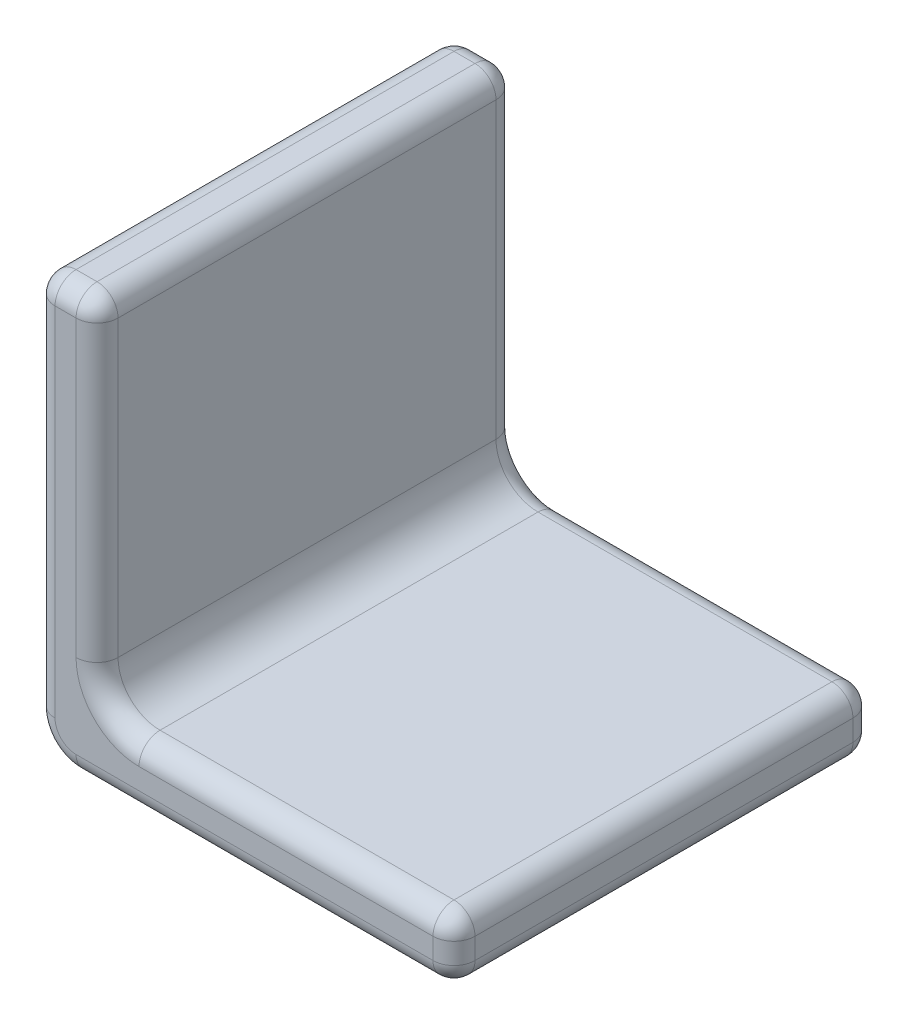
ISO-10303-21;
HEADER;
FILE_DESCRIPTION(('STEP AP214'),'2;1');
FILE_NAME('part.step','',(''),(''),'','','');
FILE_SCHEMA(('AUTOMOTIVE_DESIGN { 1 0 10303 214 1 1 1 1 }'));
ENDSEC;
DATA;
#1=APPLICATION_CONTEXT('core data for automotive mechanical design processes');
#2=APPLICATION_PROTOCOL_DEFINITION('international standard','automotive_design',2000,#1);
#3=PRODUCT_CONTEXT('',#1,'mechanical');
#4=PRODUCT('Part','Part','',(#3));
#5=PRODUCT_RELATED_PRODUCT_CATEGORY('part','',(#4));
#6=PRODUCT_DEFINITION_FORMATION('','',#4);
#7=PRODUCT_DEFINITION_CONTEXT('part definition',#1,'design');
#8=PRODUCT_DEFINITION('design','',#6,#7);
#9=PRODUCT_DEFINITION_SHAPE('','',#8);
#10=(LENGTH_UNIT() NAMED_UNIT(*) SI_UNIT(.MILLI.,.METRE.));
#11=(NAMED_UNIT(*) PLANE_ANGLE_UNIT() SI_UNIT($,.RADIAN.));
#12=(NAMED_UNIT(*) SI_UNIT($,.STERADIAN.) SOLID_ANGLE_UNIT());
#13=UNCERTAINTY_MEASURE_WITH_UNIT(LENGTH_MEASURE(1.E-05),#10,'distance_accuracy_value','');
#14=(GEOMETRIC_REPRESENTATION_CONTEXT(3) GLOBAL_UNCERTAINTY_ASSIGNED_CONTEXT((#13)) GLOBAL_UNIT_ASSIGNED_CONTEXT((#10,
#11,#12)) REPRESENTATION_CONTEXT('',''));
#15=CARTESIAN_POINT('',(0.,0.,0.));
#16=DIRECTION('',(0.,0.,1.));
#17=DIRECTION('',(1.,0.,0.));
#18=AXIS2_PLACEMENT_3D('',#15,#16,#17);
#19=CARTESIAN_POINT('',(5.,5.,20.));
#20=DIRECTION('',(0.,0.,-1.));
#21=DIRECTION('',(-1.,0.,0.));
#22=AXIS2_PLACEMENT_3D('',#19,#20,#21);
#23=CYLINDRICAL_SURFACE('',#22,2.);
#24=DIRECTION('',(0.,0.,-1.));
#25=VECTOR('',#24,1.);
#26=CARTESIAN_POINT('',(5.00000000000002,3.,20.));
#27=LINE('',#26,#25);
#28=CARTESIAN_POINT('',(5.00000000000002,3.,19.));
#29=VERTEX_POINT('',#28);
#30=CARTESIAN_POINT('',(5.00000000000002,3.,1.));
#31=VERTEX_POINT('',#30);
#32=EDGE_CURVE('E323',#29,#31,#27,.T.);
#33=ORIENTED_EDGE('',*,*,#32,.T.);
#34=CARTESIAN_POINT('',(5.,5.,1.));
#35=DIRECTION('',(0.,0.,1.));
#36=DIRECTION('',(1.,0.,0.));
#37=AXIS2_PLACEMENT_3D('',#34,#35,#36);
#38=CIRCLE('',#37,2.);
#39=CARTESIAN_POINT('',(3.,5.00000000000002,1.));
#40=VERTEX_POINT('',#39);
#41=EDGE_CURVE('E275',#31,#40,#38,.F.);
#42=ORIENTED_EDGE('',*,*,#41,.T.);
#43=DIRECTION('',(0.,0.,-1.));
#44=VECTOR('',#43,1.);
#45=CARTESIAN_POINT('',(3.,5.00000000000002,20.));
#46=LINE('',#45,#44);
#47=CARTESIAN_POINT('',(3.,5.00000000000002,19.));
#48=VERTEX_POINT('',#47);
#49=EDGE_CURVE('E199',#48,#40,#46,.T.);
#50=ORIENTED_EDGE('',*,*,#49,.F.);
#51=CARTESIAN_POINT('',(5.,5.,19.));
#52=DIRECTION('',(0.,0.,1.));
#53=DIRECTION('',(1.,0.,0.));
#54=AXIS2_PLACEMENT_3D('',#51,#52,#53);
#55=CIRCLE('',#54,2.);
#56=EDGE_CURVE('E273',#48,#29,#55,.T.);
#57=ORIENTED_EDGE('',*,*,#56,.T.);
#58=EDGE_LOOP('',(#33,#42,#50,#57));
#59=FACE_BOUND('',#58,.T.);
#60=ADVANCED_FACE('F39',(#59),#23,.F.);
#61=CARTESIAN_POINT('',(3.,5.00000000000002,20.));
#62=DIRECTION('',(-1.,0.,0.));
#63=DIRECTION('',(0.,0.,1.));
#64=AXIS2_PLACEMENT_3D('',#61,#62,#63);
#65=PLANE('',#64);
#66=ORIENTED_EDGE('',*,*,#49,.T.);
#67=DIRECTION('',(0.,1.,0.));
#68=VECTOR('',#67,1.);
#69=CARTESIAN_POINT('',(3.,5.00000000000002,1.));
#70=LINE('',#69,#68);
#71=CARTESIAN_POINT('',(3.,19.,1.));
#72=VERTEX_POINT('',#71);
#73=EDGE_CURVE('E198',#40,#72,#70,.T.);
#74=ORIENTED_EDGE('',*,*,#73,.T.);
#75=DIRECTION('',(0.,0.,-1.));
#76=VECTOR('',#75,1.);
#77=CARTESIAN_POINT('',(3.,19.,20.));
#78=LINE('',#77,#76);
#79=CARTESIAN_POINT('',(3.,19.,19.));
#80=VERTEX_POINT('',#79);
#81=EDGE_CURVE('E180',#80,#72,#78,.T.);
#82=ORIENTED_EDGE('',*,*,#81,.F.);
#83=DIRECTION('',(0.,1.,0.));
#84=VECTOR('',#83,1.);
#85=CARTESIAN_POINT('',(3.,5.00000000000002,19.));
#86=LINE('',#85,#84);
#87=EDGE_CURVE('E195',#80,#48,#86,.F.);
#88=ORIENTED_EDGE('',*,*,#87,.T.);
#89=EDGE_LOOP('',(#66,#74,#82,#88));
#90=FACE_BOUND('',#89,.T.);
#91=ADVANCED_FACE('F193',(#90),#65,.F.);
#92=CARTESIAN_POINT('',(2.,19.,20.));
#93=DIRECTION('',(0.,0.,-1.));
#94=DIRECTION('',(-1.,0.,0.));
#95=AXIS2_PLACEMENT_3D('',#92,#93,#94);
#96=CYLINDRICAL_SURFACE('',#95,1.);
#97=ORIENTED_EDGE('',*,*,#81,.T.);
#98=CARTESIAN_POINT('',(2.,19.,1.));
#99=DIRECTION('',(0.,0.,-1.));
#100=DIRECTION('',(-1.,0.,0.));
#101=AXIS2_PLACEMENT_3D('',#98,#99,#100);
#102=CIRCLE('',#101,1.);
#103=CARTESIAN_POINT('',(1.99999999999999,20.,1.));
#104=VERTEX_POINT('',#103);
#105=EDGE_CURVE('E187',#72,#104,#102,.F.);
#106=ORIENTED_EDGE('',*,*,#105,.T.);
#107=DIRECTION('',(0.,0.,-1.));
#108=VECTOR('',#107,1.);
#109=CARTESIAN_POINT('',(1.99999999999999,20.,20.));
#110=LINE('',#109,#108);
#111=CARTESIAN_POINT('',(1.99999999999999,20.,19.));
#112=VERTEX_POINT('',#111);
#113=EDGE_CURVE('E182',#112,#104,#110,.T.);
#114=ORIENTED_EDGE('',*,*,#113,.F.);
#115=CARTESIAN_POINT('',(2.,19.,19.));
#116=DIRECTION('',(0.,0.,-1.));
#117=DIRECTION('',(-1.,0.,0.));
#118=AXIS2_PLACEMENT_3D('',#115,#116,#117);
#119=CIRCLE('',#118,1.);
#120=EDGE_CURVE('E177',#112,#80,#119,.T.);
#121=ORIENTED_EDGE('',*,*,#120,.T.);
#122=EDGE_LOOP('',(#97,#106,#114,#121));
#123=FACE_BOUND('',#122,.T.);
#124=ADVANCED_FACE('F179',(#123),#96,.T.);
#125=CARTESIAN_POINT('',(1.00000000000001,20.,20.));
#126=DIRECTION('',(0.,-1.,0.));
#127=DIRECTION('',(0.,0.,-1.));
#128=AXIS2_PLACEMENT_3D('',#125,#126,#127);
#129=PLANE('',#128);
#130=ORIENTED_EDGE('',*,*,#113,.T.);
#131=DIRECTION('',(-1.,0.,0.));
#132=VECTOR('',#131,1.);
#133=CARTESIAN_POINT('',(1.00000000000001,20.,1.));
#134=LINE('',#133,#132);
#135=CARTESIAN_POINT('',(1.00000000000001,20.,1.));
#136=VERTEX_POINT('',#135);
#137=EDGE_CURVE('E238',#104,#136,#134,.T.);
#138=ORIENTED_EDGE('',*,*,#137,.T.);
#139=DIRECTION('',(0.,0.,-1.));
#140=VECTOR('',#139,1.);
#141=CARTESIAN_POINT('',(1.00000000000001,20.,20.));
#142=LINE('',#141,#140);
#143=CARTESIAN_POINT('',(1.00000000000001,20.,19.));
#144=VERTEX_POINT('',#143);
#145=EDGE_CURVE('E372',#144,#136,#142,.T.);
#146=ORIENTED_EDGE('',*,*,#145,.F.);
#147=DIRECTION('',(-1.,0.,0.));
#148=VECTOR('',#147,1.);
#149=CARTESIAN_POINT('',(1.99999999999999,20.,19.));
#150=LINE('',#149,#148);
#151=EDGE_CURVE('E236',#144,#112,#150,.F.);
#152=ORIENTED_EDGE('',*,*,#151,.T.);
#153=EDGE_LOOP('',(#130,#138,#146,#152));
#154=FACE_BOUND('',#153,.T.);
#155=ADVANCED_FACE('F381',(#154),#129,.F.);
#156=CARTESIAN_POINT('',(1.,19.,20.));
#157=DIRECTION('',(0.,0.,-1.));
#158=DIRECTION('',(-1.,0.,0.));
#159=AXIS2_PLACEMENT_3D('',#156,#157,#158);
#160=CYLINDRICAL_SURFACE('',#159,1.);
#161=ORIENTED_EDGE('',*,*,#145,.T.);
#162=CARTESIAN_POINT('',(1.,19.,1.));
#163=DIRECTION('',(0.,0.,-1.));
#164=DIRECTION('',(-1.,0.,0.));
#165=AXIS2_PLACEMENT_3D('',#162,#163,#164);
#166=CIRCLE('',#165,1.);
#167=CARTESIAN_POINT('',(0.,19.,1.));
#168=VERTEX_POINT('',#167);
#169=EDGE_CURVE('E242',#136,#168,#166,.F.);
#170=ORIENTED_EDGE('',*,*,#169,.T.);
#171=DIRECTION('',(0.,0.,-1.));
#172=VECTOR('',#171,1.);
#173=CARTESIAN_POINT('',(0.,19.,20.));
#174=LINE('',#173,#172);
#175=CARTESIAN_POINT('',(0.,19.,19.));
#176=VERTEX_POINT('',#175);
#177=EDGE_CURVE('E363',#176,#168,#174,.T.);
#178=ORIENTED_EDGE('',*,*,#177,.F.);
#179=CARTESIAN_POINT('',(1.,19.,19.));
#180=DIRECTION('',(0.,0.,-1.));
#181=DIRECTION('',(-1.,0.,0.));
#182=AXIS2_PLACEMENT_3D('',#179,#180,#181);
#183=CIRCLE('',#182,1.);
#184=EDGE_CURVE('E240',#176,#144,#183,.T.);
#185=ORIENTED_EDGE('',*,*,#184,.T.);
#186=EDGE_LOOP('',(#161,#170,#178,#185));
#187=FACE_BOUND('',#186,.T.);
#188=ADVANCED_FACE('F369',(#187),#160,.T.);
#189=CARTESIAN_POINT('',(0.,2.00000000000001,20.));
#190=DIRECTION('',(1.,0.,0.));
#191=DIRECTION('',(0.,0.,-1.));
#192=AXIS2_PLACEMENT_3D('',#189,#190,#191);
#193=PLANE('',#192);
#194=ORIENTED_EDGE('',*,*,#177,.T.);
#195=DIRECTION('',(0.,-1.,0.));
#196=VECTOR('',#195,1.);
#197=CARTESIAN_POINT('',(0.,2.00000000000001,1.));
#198=LINE('',#197,#196);
#199=CARTESIAN_POINT('',(0.,2.00000000000001,1.));
#200=VERTEX_POINT('',#199);
#201=EDGE_CURVE('E246',#168,#200,#198,.T.);
#202=ORIENTED_EDGE('',*,*,#201,.T.);
#203=DIRECTION('',(0.,0.,-1.));
#204=VECTOR('',#203,1.);
#205=CARTESIAN_POINT('',(0.,2.00000000000001,20.));
#206=LINE('',#205,#204);
#207=CARTESIAN_POINT('',(0.,2.00000000000001,19.));
#208=VERTEX_POINT('',#207);
#209=EDGE_CURVE('E366',#208,#200,#206,.T.);
#210=ORIENTED_EDGE('',*,*,#209,.F.);
#211=DIRECTION('',(0.,-1.,0.));
#212=VECTOR('',#211,1.);
#213=CARTESIAN_POINT('',(0.,19.,19.));
#214=LINE('',#213,#212);
#215=EDGE_CURVE('E244',#208,#176,#214,.F.);
#216=ORIENTED_EDGE('',*,*,#215,.T.);
#217=EDGE_LOOP('',(#194,#202,#210,#216));
#218=FACE_BOUND('',#217,.T.);
#219=ADVANCED_FACE('F362',(#218),#193,.F.);
#220=CARTESIAN_POINT('',(2.,2.,20.));
#221=DIRECTION('',(0.,0.,-1.));
#222=DIRECTION('',(-1.,0.,0.));
#223=AXIS2_PLACEMENT_3D('',#220,#221,#222);
#224=CYLINDRICAL_SURFACE('',#223,2.);
#225=ORIENTED_EDGE('',*,*,#209,.T.);
#226=CARTESIAN_POINT('',(2.,2.,1.));
#227=DIRECTION('',(0.,0.,1.));
#228=DIRECTION('',(1.,0.,0.));
#229=AXIS2_PLACEMENT_3D('',#226,#227,#228);
#230=CIRCLE('',#229,2.);
#231=CARTESIAN_POINT('',(2.00000000000001,0.,1.));
#232=VERTEX_POINT('',#231);
#233=EDGE_CURVE('E250',#200,#232,#230,.T.);
#234=ORIENTED_EDGE('',*,*,#233,.T.);
#235=DIRECTION('',(0.,0.,-1.));
#236=VECTOR('',#235,1.);
#237=CARTESIAN_POINT('',(2.00000000000001,0.,20.));
#238=LINE('',#237,#236);
#239=CARTESIAN_POINT('',(2.00000000000001,0.,19.));
#240=VERTEX_POINT('',#239);
#241=EDGE_CURVE('E375',#240,#232,#238,.T.);
#242=ORIENTED_EDGE('',*,*,#241,.F.);
#243=CARTESIAN_POINT('',(2.,2.,19.));
#244=DIRECTION('',(0.,0.,1.));
#245=DIRECTION('',(1.,0.,0.));
#246=AXIS2_PLACEMENT_3D('',#243,#244,#245);
#247=CIRCLE('',#246,2.);
#248=EDGE_CURVE('E248',#240,#208,#247,.F.);
#249=ORIENTED_EDGE('',*,*,#248,.T.);
#250=EDGE_LOOP('',(#225,#234,#242,#249));
#251=FACE_BOUND('',#250,.T.);
#252=ADVANCED_FACE('F749',(#251),#224,.T.);
#253=CARTESIAN_POINT('',(5.67919075144509,0.,20.));
#254=DIRECTION('',(0.,1.,0.));
#255=DIRECTION('',(0.,0.,1.));
#256=AXIS2_PLACEMENT_3D('',#253,#254,#255);
#257=PLANE('',#256);
#258=ORIENTED_EDGE('',*,*,#241,.T.);
#259=DIRECTION('',(1.,0.,0.));
#260=VECTOR('',#259,1.);
#261=CARTESIAN_POINT('',(5.67919075144509,0.,1.));
#262=LINE('',#261,#260);
#263=CARTESIAN_POINT('',(19.,0.,1.));
#264=VERTEX_POINT('',#263);
#265=EDGE_CURVE('E254',#232,#264,#262,.T.);
#266=ORIENTED_EDGE('',*,*,#265,.T.);
#267=DIRECTION('',(0.,0.,-1.));
#268=VECTOR('',#267,1.);
#269=CARTESIAN_POINT('',(19.,0.,20.));
#270=LINE('',#269,#268);
#271=CARTESIAN_POINT('',(19.,0.,19.));
#272=VERTEX_POINT('',#271);
#273=EDGE_CURVE('E831',#272,#264,#270,.T.);
#274=ORIENTED_EDGE('',*,*,#273,.F.);
#275=DIRECTION('',(1.,0.,0.));
#276=VECTOR('',#275,1.);
#277=CARTESIAN_POINT('',(2.00000000000001,0.,19.));
#278=LINE('',#277,#276);
#279=EDGE_CURVE('E252',#272,#240,#278,.F.);
#280=ORIENTED_EDGE('',*,*,#279,.T.);
#281=EDGE_LOOP('',(#258,#266,#274,#280));
#282=FACE_BOUND('',#281,.T.);
#283=ADVANCED_FACE('F738',(#282),#257,.F.);
#284=CARTESIAN_POINT('',(19.,1.,20.));
#285=DIRECTION('',(0.,0.,-1.));
#286=DIRECTION('',(-1.,0.,0.));
#287=AXIS2_PLACEMENT_3D('',#284,#285,#286);
#288=CYLINDRICAL_SURFACE('',#287,1.);
#289=ORIENTED_EDGE('',*,*,#273,.T.);
#290=CARTESIAN_POINT('',(19.,1.,1.));
#291=DIRECTION('',(0.,0.,-1.));
#292=DIRECTION('',(-1.,0.,0.));
#293=AXIS2_PLACEMENT_3D('',#290,#291,#292);
#294=CIRCLE('',#293,1.);
#295=CARTESIAN_POINT('',(20.,1.,1.));
#296=VERTEX_POINT('',#295);
#297=EDGE_CURVE('E258',#264,#296,#294,.F.);
#298=ORIENTED_EDGE('',*,*,#297,.T.);
#299=DIRECTION('',(0.,0.,-1.));
#300=VECTOR('',#299,1.);
#301=CARTESIAN_POINT('',(20.,1.,20.));
#302=LINE('',#301,#300);
#303=CARTESIAN_POINT('',(20.,1.,19.));
#304=VERTEX_POINT('',#303);
#305=EDGE_CURVE('E836',#304,#296,#302,.T.);
#306=ORIENTED_EDGE('',*,*,#305,.F.);
#307=CARTESIAN_POINT('',(19.,1.,19.));
#308=DIRECTION('',(0.,0.,-1.));
#309=DIRECTION('',(-1.,0.,0.));
#310=AXIS2_PLACEMENT_3D('',#307,#308,#309);
#311=CIRCLE('',#310,1.);
#312=EDGE_CURVE('E256',#304,#272,#311,.T.);
#313=ORIENTED_EDGE('',*,*,#312,.T.);
#314=EDGE_LOOP('',(#289,#298,#306,#313));
#315=FACE_BOUND('',#314,.T.);
#316=ADVANCED_FACE('F727',(#315),#288,.T.);
#317=CARTESIAN_POINT('',(20.,1.,20.));
#318=DIRECTION('',(-1.,0.,0.));
#319=DIRECTION('',(0.,0.,1.));
#320=AXIS2_PLACEMENT_3D('',#317,#318,#319);
#321=PLANE('',#320);
#322=ORIENTED_EDGE('',*,*,#305,.T.);
#323=DIRECTION('',(0.,1.,0.));
#324=VECTOR('',#323,1.);
#325=CARTESIAN_POINT('',(20.,1.,1.));
#326=LINE('',#325,#324);
#327=CARTESIAN_POINT('',(20.,2.,1.));
#328=VERTEX_POINT('',#327);
#329=EDGE_CURVE('E262',#296,#328,#326,.T.);
#330=ORIENTED_EDGE('',*,*,#329,.T.);
#331=DIRECTION('',(0.,0.,-1.));
#332=VECTOR('',#331,1.);
#333=CARTESIAN_POINT('',(20.,2.,20.));
#334=LINE('',#333,#332);
#335=CARTESIAN_POINT('',(20.,2.,19.));
#336=VERTEX_POINT('',#335);
#337=EDGE_CURVE('E838',#336,#328,#334,.T.);
#338=ORIENTED_EDGE('',*,*,#337,.F.);
#339=DIRECTION('',(0.,1.,0.));
#340=VECTOR('',#339,1.);
#341=CARTESIAN_POINT('',(20.,1.,19.));
#342=LINE('',#341,#340);
#343=EDGE_CURVE('E260',#336,#304,#342,.F.);
#344=ORIENTED_EDGE('',*,*,#343,.T.);
#345=EDGE_LOOP('',(#322,#330,#338,#344));
#346=FACE_BOUND('',#345,.T.);
#347=ADVANCED_FACE('F716',(#346),#321,.F.);
#348=CARTESIAN_POINT('',(19.,2.,20.));
#349=DIRECTION('',(0.,0.,-1.));
#350=DIRECTION('',(-1.,0.,0.));
#351=AXIS2_PLACEMENT_3D('',#348,#349,#350);
#352=CYLINDRICAL_SURFACE('',#351,1.);
#353=ORIENTED_EDGE('',*,*,#337,.T.);
#354=CARTESIAN_POINT('',(19.,2.,1.));
#355=DIRECTION('',(0.,0.,-1.));
#356=DIRECTION('',(-1.,0.,0.));
#357=AXIS2_PLACEMENT_3D('',#354,#355,#356);
#358=CIRCLE('',#357,1.);
#359=CARTESIAN_POINT('',(19.,3.,1.));
#360=VERTEX_POINT('',#359);
#361=EDGE_CURVE('E266',#328,#360,#358,.F.);
#362=ORIENTED_EDGE('',*,*,#361,.T.);
#363=DIRECTION('',(0.,0.,-1.));
#364=VECTOR('',#363,1.);
#365=CARTESIAN_POINT('',(19.,3.,20.));
#366=LINE('',#365,#364);
#367=CARTESIAN_POINT('',(19.,3.,19.));
#368=VERTEX_POINT('',#367);
#369=EDGE_CURVE('E843',#368,#360,#366,.T.);
#370=ORIENTED_EDGE('',*,*,#369,.F.);
#371=CARTESIAN_POINT('',(19.,2.,19.));
#372=DIRECTION('',(0.,0.,-1.));
#373=DIRECTION('',(-1.,0.,0.));
#374=AXIS2_PLACEMENT_3D('',#371,#372,#373);
#375=CIRCLE('',#374,1.);
#376=EDGE_CURVE('E264',#368,#336,#375,.T.);
#377=ORIENTED_EDGE('',*,*,#376,.T.);
#378=EDGE_LOOP('',(#353,#362,#370,#377));
#379=FACE_BOUND('',#378,.T.);
#380=ADVANCED_FACE('F705',(#379),#352,.T.);
#381=CARTESIAN_POINT('',(5.00000000000002,3.,20.));
#382=DIRECTION('',(0.,-1.,0.));
#383=DIRECTION('',(0.,0.,-1.));
#384=AXIS2_PLACEMENT_3D('',#381,#382,#383);
#385=PLANE('',#384);
#386=ORIENTED_EDGE('',*,*,#369,.T.);
#387=DIRECTION('',(-1.,0.,0.));
#388=VECTOR('',#387,1.);
#389=CARTESIAN_POINT('',(5.00000000000002,3.,1.));
#390=LINE('',#389,#388);
#391=EDGE_CURVE('E271',#360,#31,#390,.T.);
#392=ORIENTED_EDGE('',*,*,#391,.T.);
#393=ORIENTED_EDGE('',*,*,#32,.F.);
#394=DIRECTION('',(-1.,0.,0.));
#395=VECTOR('',#394,1.);
#396=CARTESIAN_POINT('',(19.,3.,19.));
#397=LINE('',#396,#395);
#398=EDGE_CURVE('E268',#29,#368,#397,.F.);
#399=ORIENTED_EDGE('',*,*,#398,.T.);
#400=EDGE_LOOP('',(#386,#392,#393,#399));
#401=FACE_BOUND('',#400,.T.);
#402=ADVANCED_FACE('F695',(#401),#385,.F.);
#403=CARTESIAN_POINT('',(5.,5.,20.));
#404=DIRECTION('',(0.,0.,1.));
#405=DIRECTION('',(1.,0.,0.));
#406=AXIS2_PLACEMENT_3D('',#403,#404,#405);
#407=PLANE('',#406);
#408=DIRECTION('',(0.,1.,0.));
#409=VECTOR('',#408,1.);
#410=CARTESIAN_POINT('',(19.,2.,20.));
#411=LINE('',#410,#409);
#412=CARTESIAN_POINT('',(19.,1.,20.));
#413=VERTEX_POINT('',#412);
#414=CARTESIAN_POINT('',(19.,2.,20.));
#415=VERTEX_POINT('',#414);
#416=EDGE_CURVE('E48',#413,#415,#411,.T.);
#417=ORIENTED_EDGE('',*,*,#416,.T.);
#418=DIRECTION('',(-1.,0.,0.));
#419=VECTOR('',#418,1.);
#420=CARTESIAN_POINT('',(5.00000000000002,2.,20.));
#421=LINE('',#420,#419);
#422=CARTESIAN_POINT('',(5.00000000000002,2.,20.));
#423=VERTEX_POINT('',#422);
#424=EDGE_CURVE('E11',#415,#423,#421,.T.);
#425=ORIENTED_EDGE('',*,*,#424,.T.);
#426=CARTESIAN_POINT('',(5.,5.,20.));
#427=DIRECTION('',(0.,0.,1.));
#428=DIRECTION('',(1.,0.,0.));
#429=AXIS2_PLACEMENT_3D('',#426,#427,#428);
#430=CIRCLE('',#429,3.);
#431=CARTESIAN_POINT('',(2.,5.00000000000002,20.));
#432=VERTEX_POINT('',#431);
#433=EDGE_CURVE('E277',#423,#432,#430,.F.);
#434=ORIENTED_EDGE('',*,*,#433,.T.);
#435=DIRECTION('',(0.,1.,0.));
#436=VECTOR('',#435,1.);
#437=CARTESIAN_POINT('',(2.,19.,20.));
#438=LINE('',#437,#436);
#439=CARTESIAN_POINT('',(2.,19.,20.));
#440=VERTEX_POINT('',#439);
#441=EDGE_CURVE('E279',#432,#440,#438,.T.);
#442=ORIENTED_EDGE('',*,*,#441,.T.);
#443=DIRECTION('',(-1.,0.,0.));
#444=VECTOR('',#443,1.);
#445=CARTESIAN_POINT('',(1.00000000000001,19.,20.));
#446=LINE('',#445,#444);
#447=CARTESIAN_POINT('',(1.,19.,20.));
#448=VERTEX_POINT('',#447);
#449=EDGE_CURVE('E281',#440,#448,#446,.T.);
#450=ORIENTED_EDGE('',*,*,#449,.T.);
#451=DIRECTION('',(0.,-1.,0.));
#452=VECTOR('',#451,1.);
#453=CARTESIAN_POINT('',(1.,2.00000000000001,20.));
#454=LINE('',#453,#452);
#455=CARTESIAN_POINT('',(1.,2.00000000000001,20.));
#456=VERTEX_POINT('',#455);
#457=EDGE_CURVE('E283',#448,#456,#454,.T.);
#458=ORIENTED_EDGE('',*,*,#457,.T.);
#459=CARTESIAN_POINT('',(2.,2.,20.));
#460=DIRECTION('',(0.,0.,1.));
#461=DIRECTION('',(1.,0.,0.));
#462=AXIS2_PLACEMENT_3D('',#459,#460,#461);
#463=CIRCLE('',#462,1.);
#464=CARTESIAN_POINT('',(2.00000000000001,1.,20.));
#465=VERTEX_POINT('',#464);
#466=EDGE_CURVE('E285',#456,#465,#463,.T.);
#467=ORIENTED_EDGE('',*,*,#466,.T.);
#468=DIRECTION('',(1.,0.,0.));
#469=VECTOR('',#468,1.);
#470=CARTESIAN_POINT('',(19.,1.,20.));
#471=LINE('',#470,#469);
#472=EDGE_CURVE('E59',#465,#413,#471,.T.);
#473=ORIENTED_EDGE('',*,*,#472,.T.);
#474=EDGE_LOOP('',(#417,#425,#434,#442,#450,#458,#467,#473));
#475=FACE_BOUND('',#474,.T.);
#476=ADVANCED_FACE('F685',(#475),#407,.T.);
#477=CARTESIAN_POINT('',(5.,5.,0.));
#478=DIRECTION('',(0.,0.,1.));
#479=DIRECTION('',(1.,0.,0.));
#480=AXIS2_PLACEMENT_3D('',#477,#478,#479);
#481=PLANE('',#480);
#482=DIRECTION('',(-1.,0.,0.));
#483=VECTOR('',#482,1.);
#484=CARTESIAN_POINT('',(5.,19.,0.));
#485=LINE('',#484,#483);
#486=CARTESIAN_POINT('',(1.,19.,0.));
#487=VERTEX_POINT('',#486);
#488=CARTESIAN_POINT('',(2.,19.,0.));
#489=VERTEX_POINT('',#488);
#490=EDGE_CURVE('E231',#487,#489,#485,.F.);
#491=ORIENTED_EDGE('',*,*,#490,.T.);
#492=DIRECTION('',(0.,1.,0.));
#493=VECTOR('',#492,1.);
#494=CARTESIAN_POINT('',(2.,5.,0.));
#495=LINE('',#494,#493);
#496=CARTESIAN_POINT('',(2.,5.00000000000002,0.));
#497=VERTEX_POINT('',#496);
#498=EDGE_CURVE('E188',#489,#497,#495,.F.);
#499=ORIENTED_EDGE('',*,*,#498,.T.);
#500=CARTESIAN_POINT('',(5.,5.,0.));
#501=DIRECTION('',(0.,0.,1.));
#502=DIRECTION('',(1.,0.,0.));
#503=AXIS2_PLACEMENT_3D('',#500,#501,#502);
#504=CIRCLE('',#503,3.);
#505=CARTESIAN_POINT('',(5.00000000000002,2.,0.));
#506=VERTEX_POINT('',#505);
#507=EDGE_CURVE('E216',#497,#506,#504,.T.);
#508=ORIENTED_EDGE('',*,*,#507,.T.);
#509=DIRECTION('',(-1.,0.,0.));
#510=VECTOR('',#509,1.);
#511=CARTESIAN_POINT('',(5.,2.,0.));
#512=LINE('',#511,#510);
#513=CARTESIAN_POINT('',(19.,2.,0.));
#514=VERTEX_POINT('',#513);
#515=EDGE_CURVE('E221',#506,#514,#512,.F.);
#516=ORIENTED_EDGE('',*,*,#515,.T.);
#517=DIRECTION('',(0.,1.,0.));
#518=VECTOR('',#517,1.);
#519=CARTESIAN_POINT('',(19.,5.,0.));
#520=LINE('',#519,#518);
#521=CARTESIAN_POINT('',(19.,1.,0.));
#522=VERTEX_POINT('',#521);
#523=EDGE_CURVE('E223',#514,#522,#520,.F.);
#524=ORIENTED_EDGE('',*,*,#523,.T.);
#525=DIRECTION('',(1.,0.,0.));
#526=VECTOR('',#525,1.);
#527=CARTESIAN_POINT('',(5.,1.,0.));
#528=LINE('',#527,#526);
#529=CARTESIAN_POINT('',(2.00000000000001,1.,0.));
#530=VERTEX_POINT('',#529);
#531=EDGE_CURVE('E225',#522,#530,#528,.F.);
#532=ORIENTED_EDGE('',*,*,#531,.T.);
#533=CARTESIAN_POINT('',(2.,2.,0.));
#534=DIRECTION('',(0.,0.,1.));
#535=DIRECTION('',(1.,0.,0.));
#536=AXIS2_PLACEMENT_3D('',#533,#534,#535);
#537=CIRCLE('',#536,1.);
#538=CARTESIAN_POINT('',(1.,2.00000000000001,0.));
#539=VERTEX_POINT('',#538);
#540=EDGE_CURVE('E227',#530,#539,#537,.F.);
#541=ORIENTED_EDGE('',*,*,#540,.T.);
#542=DIRECTION('',(0.,-1.,0.));
#543=VECTOR('',#542,1.);
#544=CARTESIAN_POINT('',(1.,5.,0.));
#545=LINE('',#544,#543);
#546=EDGE_CURVE('E229',#539,#487,#545,.F.);
#547=ORIENTED_EDGE('',*,*,#546,.T.);
#548=EDGE_LOOP('',(#491,#499,#508,#516,#524,#532,#541,#547));
#549=FACE_BOUND('',#548,.T.);
#550=ADVANCED_FACE('F398',(#549),#481,.F.);
#551=CARTESIAN_POINT('',(5.67919075144509,1.,1.));
#552=DIRECTION('',(1.,0.,0.));
#553=DIRECTION('',(0.,0.,-1.));
#554=AXIS2_PLACEMENT_3D('',#551,#552,#553);
#555=CYLINDRICAL_SURFACE('',#554,1.);
#556=CARTESIAN_POINT('',(19.,1.,1.));
#557=DIRECTION('',(1.,0.,0.));
#558=DIRECTION('',(0.,0.,-1.));
#559=AXIS2_PLACEMENT_3D('',#556,#557,#558);
#560=CIRCLE('',#559,1.);
#561=EDGE_CURVE('E320',#264,#522,#560,.T.);
#562=ORIENTED_EDGE('',*,*,#561,.F.);
#563=ORIENTED_EDGE('',*,*,#265,.F.);
#564=CARTESIAN_POINT('',(2.00000000000001,1.,1.));
#565=DIRECTION('',(-1.,0.,0.));
#566=DIRECTION('',(0.,-1.,0.));
#567=AXIS2_PLACEMENT_3D('',#564,#565,#566);
#568=CIRCLE('',#567,1.);
#569=EDGE_CURVE('E317',#530,#232,#568,.T.);
#570=ORIENTED_EDGE('',*,*,#569,.F.);
#571=ORIENTED_EDGE('',*,*,#531,.F.);
#572=EDGE_LOOP('',(#562,#563,#570,#571));
#573=FACE_BOUND('',#572,.T.);
#574=ADVANCED_FACE('F664',(#573),#555,.T.);
#575=CARTESIAN_POINT('',(19.,1.,1.));
#576=DIRECTION('',(0.,0.,1.));
#577=DIRECTION('',(1.,0.,0.));
#578=AXIS2_PLACEMENT_3D('',#575,#576,#577);
#579=SPHERICAL_SURFACE('',#578,1.);
#580=ORIENTED_EDGE('',*,*,#297,.F.);
#581=ORIENTED_EDGE('',*,*,#561,.T.);
#582=CARTESIAN_POINT('',(19.,1.,1.));
#583=DIRECTION('',(0.,1.,0.));
#584=DIRECTION('',(0.,0.,1.));
#585=AXIS2_PLACEMENT_3D('',#582,#583,#584);
#586=CIRCLE('',#585,1.);
#587=EDGE_CURVE('E314',#296,#522,#586,.T.);
#588=ORIENTED_EDGE('',*,*,#587,.F.);
#589=EDGE_LOOP('',(#580,#581,#588));
#590=FACE_BOUND('',#589,.T.);
#591=ADVANCED_FACE('F653',(#590),#579,.T.);
#592=CARTESIAN_POINT('',(2.,2.,1.));
#593=DIRECTION('',(0.,0.,1.));
#594=DIRECTION('',(1.,0.,0.));
#595=AXIS2_PLACEMENT_3D('',#592,#593,#594);
#596=DEGENERATE_TOROIDAL_SURFACE('',#595,1.,1.,.T.);
#597=ORIENTED_EDGE('',*,*,#569,.T.);
#598=ORIENTED_EDGE('',*,*,#233,.F.);
#599=CARTESIAN_POINT('',(1.,2.00000000000001,1.));
#600=DIRECTION('',(0.,1.,0.));
#601=DIRECTION('',(0.,0.,1.));
#602=AXIS2_PLACEMENT_3D('',#599,#600,#601);
#603=CIRCLE('',#602,1.);
#604=EDGE_CURVE('E311',#539,#200,#603,.T.);
#605=ORIENTED_EDGE('',*,*,#604,.F.);
#606=ORIENTED_EDGE('',*,*,#540,.F.);
#607=EDGE_LOOP('',(#597,#598,#605,#606));
#608=FACE_BOUND('',#607,.T.);
#609=ADVANCED_FACE('F642',(#608),#596,.T.);
#610=CARTESIAN_POINT('',(19.,1.,1.));
#611=DIRECTION('',(0.,1.,0.));
#612=DIRECTION('',(0.,0.,1.));
#613=AXIS2_PLACEMENT_3D('',#610,#611,#612);
#614=CYLINDRICAL_SURFACE('',#613,1.);
#615=ORIENTED_EDGE('',*,*,#587,.T.);
#616=ORIENTED_EDGE('',*,*,#523,.F.);
#617=CARTESIAN_POINT('',(19.,2.,1.));
#618=DIRECTION('',(0.,1.,0.));
#619=DIRECTION('',(0.,0.,1.));
#620=AXIS2_PLACEMENT_3D('',#617,#618,#619);
#621=CIRCLE('',#620,1.);
#622=EDGE_CURVE('E308',#328,#514,#621,.T.);
#623=ORIENTED_EDGE('',*,*,#622,.F.);
#624=ORIENTED_EDGE('',*,*,#329,.F.);
#625=EDGE_LOOP('',(#615,#616,#623,#624));
#626=FACE_BOUND('',#625,.T.);
#627=ADVANCED_FACE('F632',(#626),#614,.T.);
#628=CARTESIAN_POINT('',(1.,2.00000000000001,1.));
#629=DIRECTION('',(0.,-1.,0.));
#630=DIRECTION('',(0.,0.,-1.));
#631=AXIS2_PLACEMENT_3D('',#628,#629,#630);
#632=CYLINDRICAL_SURFACE('',#631,1.);
#633=ORIENTED_EDGE('',*,*,#604,.T.);
#634=ORIENTED_EDGE('',*,*,#201,.F.);
#635=CARTESIAN_POINT('',(1.,19.,1.));
#636=DIRECTION('',(0.,1.,0.));
#637=DIRECTION('',(-1.,0.,0.));
#638=AXIS2_PLACEMENT_3D('',#635,#636,#637);
#639=CIRCLE('',#638,1.);
#640=EDGE_CURVE('E305',#487,#168,#639,.T.);
#641=ORIENTED_EDGE('',*,*,#640,.F.);
#642=ORIENTED_EDGE('',*,*,#546,.F.);
#643=EDGE_LOOP('',(#633,#634,#641,#642));
#644=FACE_BOUND('',#643,.T.);
#645=ADVANCED_FACE('F405',(#644),#632,.T.);
#646=CARTESIAN_POINT('',(19.,2.,1.));
#647=DIRECTION('',(0.,0.,1.));
#648=DIRECTION('',(1.,0.,0.));
#649=AXIS2_PLACEMENT_3D('',#646,#647,#648);
#650=SPHERICAL_SURFACE('',#649,1.);
#651=ORIENTED_EDGE('',*,*,#361,.F.);
#652=ORIENTED_EDGE('',*,*,#622,.T.);
#653=CARTESIAN_POINT('',(19.,2.,1.));
#654=DIRECTION('',(-1.,0.,0.));
#655=DIRECTION('',(0.,0.,1.));
#656=AXIS2_PLACEMENT_3D('',#653,#654,#655);
#657=CIRCLE('',#656,1.);
#658=EDGE_CURVE('E302',#360,#514,#657,.T.);
#659=ORIENTED_EDGE('',*,*,#658,.F.);
#660=EDGE_LOOP('',(#651,#652,#659));
#661=FACE_BOUND('',#660,.T.);
#662=ADVANCED_FACE('F410',(#661),#650,.T.);
#663=CARTESIAN_POINT('',(1.,19.,1.));
#664=DIRECTION('',(0.,0.,1.));
#665=DIRECTION('',(1.,0.,0.));
#666=AXIS2_PLACEMENT_3D('',#663,#664,#665);
#667=SPHERICAL_SURFACE('',#666,1.);
#668=ORIENTED_EDGE('',*,*,#640,.T.);
#669=ORIENTED_EDGE('',*,*,#169,.F.);
#670=CARTESIAN_POINT('',(1.,19.,1.));
#671=DIRECTION('',(1.,0.,0.));
#672=DIRECTION('',(0.,1.,0.));
#673=AXIS2_PLACEMENT_3D('',#670,#671,#672);
#674=CIRCLE('',#673,1.);
#675=EDGE_CURVE('E299',#487,#136,#674,.T.);
#676=ORIENTED_EDGE('',*,*,#675,.F.);
#677=EDGE_LOOP('',(#668,#669,#676));
#678=FACE_BOUND('',#677,.T.);
#679=ADVANCED_FACE('F407',(#678),#667,.T.);
#680=CARTESIAN_POINT('',(5.00000000000002,2.,1.));
#681=DIRECTION('',(-1.,0.,0.));
#682=DIRECTION('',(0.,0.,1.));
#683=AXIS2_PLACEMENT_3D('',#680,#681,#682);
#684=CYLINDRICAL_SURFACE('',#683,1.);
#685=ORIENTED_EDGE('',*,*,#658,.T.);
#686=ORIENTED_EDGE('',*,*,#515,.F.);
#687=CARTESIAN_POINT('',(5.00000000000002,2.,1.));
#688=DIRECTION('',(-1.,0.,0.));
#689=DIRECTION('',(0.,0.,1.));
#690=AXIS2_PLACEMENT_3D('',#687,#688,#689);
#691=CIRCLE('',#690,1.);
#692=EDGE_CURVE('E296',#31,#506,#691,.T.);
#693=ORIENTED_EDGE('',*,*,#692,.F.);
#694=ORIENTED_EDGE('',*,*,#391,.F.);
#695=EDGE_LOOP('',(#685,#686,#693,#694));
#696=FACE_BOUND('',#695,.T.);
#697=ADVANCED_FACE('F409',(#696),#684,.T.);
#698=CARTESIAN_POINT('',(1.00000000000001,19.,1.));
#699=DIRECTION('',(-1.,0.,0.));
#700=DIRECTION('',(0.,0.,1.));
#701=AXIS2_PLACEMENT_3D('',#698,#699,#700);
#702=CYLINDRICAL_SURFACE('',#701,1.);
#703=ORIENTED_EDGE('',*,*,#675,.T.);
#704=ORIENTED_EDGE('',*,*,#137,.F.);
#705=CARTESIAN_POINT('',(2.,19.,1.));
#706=DIRECTION('',(1.,0.,0.));
#707=DIRECTION('',(0.,1.,0.));
#708=AXIS2_PLACEMENT_3D('',#705,#706,#707);
#709=CIRCLE('',#708,1.);
#710=EDGE_CURVE('E293',#489,#104,#709,.T.);
#711=ORIENTED_EDGE('',*,*,#710,.F.);
#712=ORIENTED_EDGE('',*,*,#490,.F.);
#713=EDGE_LOOP('',(#703,#704,#711,#712));
#714=FACE_BOUND('',#713,.T.);
#715=ADVANCED_FACE('F385',(#714),#702,.T.);
#716=CARTESIAN_POINT('',(5.,5.,1.));
#717=DIRECTION('',(0.,0.,1.));
#718=DIRECTION('',(1.,0.,0.));
#719=AXIS2_PLACEMENT_3D('',#716,#717,#718);
#720=TOROIDAL_SURFACE('',#719,3.,1.);
#721=ORIENTED_EDGE('',*,*,#692,.T.);
#722=ORIENTED_EDGE('',*,*,#507,.F.);
#723=CARTESIAN_POINT('',(2.,5.00000000000002,1.));
#724=DIRECTION('',(0.,1.,0.));
#725=DIRECTION('',(-1.,0.,0.));
#726=AXIS2_PLACEMENT_3D('',#723,#724,#725);
#727=CIRCLE('',#726,1.);
#728=EDGE_CURVE('E291',#40,#497,#727,.T.);
#729=ORIENTED_EDGE('',*,*,#728,.F.);
#730=ORIENTED_EDGE('',*,*,#41,.F.);
#731=EDGE_LOOP('',(#721,#722,#729,#730));
#732=FACE_BOUND('',#731,.T.);
#733=ADVANCED_FACE('F434',(#732),#720,.T.);
#734=CARTESIAN_POINT('',(2.,19.,1.));
#735=DIRECTION('',(0.,0.,1.));
#736=DIRECTION('',(1.,0.,0.));
#737=AXIS2_PLACEMENT_3D('',#734,#735,#736);
#738=SPHERICAL_SURFACE('',#737,1.);
#739=ORIENTED_EDGE('',*,*,#710,.T.);
#740=ORIENTED_EDGE('',*,*,#105,.F.);
#741=CARTESIAN_POINT('',(2.,19.,1.));
#742=DIRECTION('',(0.,-1.,0.));
#743=DIRECTION('',(1.,0.,0.));
#744=AXIS2_PLACEMENT_3D('',#741,#742,#743);
#745=CIRCLE('',#744,1.);
#746=EDGE_CURVE('E289',#489,#72,#745,.T.);
#747=ORIENTED_EDGE('',*,*,#746,.F.);
#748=EDGE_LOOP('',(#739,#740,#747));
#749=FACE_BOUND('',#748,.T.);
#750=ADVANCED_FACE('F392',(#749),#738,.T.);
#751=CARTESIAN_POINT('',(2.,5.00000000000002,1.));
#752=DIRECTION('',(0.,1.,0.));
#753=DIRECTION('',(0.,0.,1.));
#754=AXIS2_PLACEMENT_3D('',#751,#752,#753);
#755=CYLINDRICAL_SURFACE('',#754,1.);
#756=ORIENTED_EDGE('',*,*,#728,.T.);
#757=ORIENTED_EDGE('',*,*,#498,.F.);
#758=ORIENTED_EDGE('',*,*,#746,.T.);
#759=ORIENTED_EDGE('',*,*,#73,.F.);
#760=EDGE_LOOP('',(#756,#757,#758,#759));
#761=FACE_BOUND('',#760,.T.);
#762=ADVANCED_FACE('F394',(#761),#755,.T.);
#763=CARTESIAN_POINT('',(1.,5.,19.));
#764=DIRECTION('',(0.,1.,0.));
#765=DIRECTION('',(0.,0.,1.));
#766=AXIS2_PLACEMENT_3D('',#763,#764,#765);
#767=CYLINDRICAL_SURFACE('',#766,1.);
#768=CARTESIAN_POINT('',(1.,19.,19.));
#769=DIRECTION('',(0.,1.,0.));
#770=DIRECTION('',(0.,0.,1.));
#771=AXIS2_PLACEMENT_3D('',#768,#769,#770);
#772=CIRCLE('',#771,1.);
#773=EDGE_CURVE('E342',#176,#448,#772,.T.);
#774=ORIENTED_EDGE('',*,*,#773,.F.);
#775=ORIENTED_EDGE('',*,*,#215,.F.);
#776=CARTESIAN_POINT('',(1.,2.00000000000001,19.));
#777=DIRECTION('',(0.,-1.,0.));
#778=DIRECTION('',(1.,0.,0.));
#779=AXIS2_PLACEMENT_3D('',#776,#777,#778);
#780=CIRCLE('',#779,1.);
#781=EDGE_CURVE('E43',#456,#208,#780,.T.);
#782=ORIENTED_EDGE('',*,*,#781,.F.);
#783=ORIENTED_EDGE('',*,*,#457,.F.);
#784=EDGE_LOOP('',(#774,#775,#782,#783));
#785=FACE_BOUND('',#784,.T.);
#786=ADVANCED_FACE('F41',(#785),#767,.T.);
#787=CARTESIAN_POINT('',(2.,2.,19.));
#788=DIRECTION('',(0.,0.,1.));
#789=DIRECTION('',(1.,0.,0.));
#790=AXIS2_PLACEMENT_3D('',#787,#788,#789);
#791=DEGENERATE_TOROIDAL_SURFACE('',#790,1.,1.,.T.);
#792=ORIENTED_EDGE('',*,*,#781,.T.);
#793=ORIENTED_EDGE('',*,*,#248,.F.);
#794=CARTESIAN_POINT('',(2.00000000000001,1.,19.));
#795=DIRECTION('',(1.,0.,0.));
#796=DIRECTION('',(0.,0.,-1.));
#797=AXIS2_PLACEMENT_3D('',#794,#795,#796);
#798=CIRCLE('',#797,1.);
#799=EDGE_CURVE('E340',#465,#240,#798,.T.);
#800=ORIENTED_EDGE('',*,*,#799,.F.);
#801=ORIENTED_EDGE('',*,*,#466,.F.);
#802=EDGE_LOOP('',(#792,#793,#800,#801));
#803=FACE_BOUND('',#802,.T.);
#804=ADVANCED_FACE('F353',(#803),#791,.T.);
#805=CARTESIAN_POINT('',(1.,19.,19.));
#806=DIRECTION('',(0.,0.,1.));
#807=DIRECTION('',(1.,0.,0.));
#808=AXIS2_PLACEMENT_3D('',#805,#806,#807);
#809=SPHERICAL_SURFACE('',#808,1.);
#810=ORIENTED_EDGE('',*,*,#184,.F.);
#811=ORIENTED_EDGE('',*,*,#773,.T.);
#812=CARTESIAN_POINT('',(1.,19.,19.));
#813=DIRECTION('',(1.,0.,0.));
#814=DIRECTION('',(0.,1.,0.));
#815=AXIS2_PLACEMENT_3D('',#812,#813,#814);
#816=CIRCLE('',#815,1.);
#817=EDGE_CURVE('E337',#144,#448,#816,.T.);
#818=ORIENTED_EDGE('',*,*,#817,.F.);
#819=EDGE_LOOP('',(#810,#811,#818));
#820=FACE_BOUND('',#819,.T.);
#821=ADVANCED_FACE('F466',(#820),#809,.T.);
#822=CARTESIAN_POINT('',(5.,1.,19.));
#823=DIRECTION('',(-1.,0.,0.));
#824=DIRECTION('',(0.,0.,1.));
#825=AXIS2_PLACEMENT_3D('',#822,#823,#824);
#826=CYLINDRICAL_SURFACE('',#825,1.);
#827=ORIENTED_EDGE('',*,*,#799,.T.);
#828=ORIENTED_EDGE('',*,*,#279,.F.);
#829=CARTESIAN_POINT('',(19.,1.,19.));
#830=DIRECTION('',(1.,0.,0.));
#831=DIRECTION('',(0.,0.,-1.));
#832=AXIS2_PLACEMENT_3D('',#829,#830,#831);
#833=CIRCLE('',#832,1.);
#834=EDGE_CURVE('E334',#413,#272,#833,.T.);
#835=ORIENTED_EDGE('',*,*,#834,.F.);
#836=ORIENTED_EDGE('',*,*,#472,.F.);
#837=EDGE_LOOP('',(#827,#828,#835,#836));
#838=FACE_BOUND('',#837,.T.);
#839=ADVANCED_FACE('F472',(#838),#826,.T.);
#840=CARTESIAN_POINT('',(5.,19.,19.));
#841=DIRECTION('',(1.,0.,0.));
#842=DIRECTION('',(0.,0.,-1.));
#843=AXIS2_PLACEMENT_3D('',#840,#841,#842);
#844=CYLINDRICAL_SURFACE('',#843,1.);
#845=ORIENTED_EDGE('',*,*,#817,.T.);
#846=ORIENTED_EDGE('',*,*,#449,.F.);
#847=CARTESIAN_POINT('',(1.99999999999999,19.,19.));
#848=DIRECTION('',(1.,0.,0.));
#849=DIRECTION('',(0.,0.,-1.));
#850=AXIS2_PLACEMENT_3D('',#847,#848,#849);
#851=CIRCLE('',#850,1.);
#852=EDGE_CURVE('E204',#112,#440,#851,.T.);
#853=ORIENTED_EDGE('',*,*,#852,.F.);
#854=ORIENTED_EDGE('',*,*,#151,.F.);
#855=EDGE_LOOP('',(#845,#846,#853,#854));
#856=FACE_BOUND('',#855,.T.);
#857=ADVANCED_FACE('F479',(#856),#844,.T.);
#858=CARTESIAN_POINT('',(19.,1.,19.));
#859=DIRECTION('',(0.,0.,1.));
#860=DIRECTION('',(1.,0.,0.));
#861=AXIS2_PLACEMENT_3D('',#858,#859,#860);
#862=SPHERICAL_SURFACE('',#861,1.);
#863=ORIENTED_EDGE('',*,*,#834,.T.);
#864=ORIENTED_EDGE('',*,*,#312,.F.);
#865=CARTESIAN_POINT('',(19.,1.,19.));
#866=DIRECTION('',(0.,1.,0.));
#867=DIRECTION('',(0.,0.,1.));
#868=AXIS2_PLACEMENT_3D('',#865,#866,#867);
#869=CIRCLE('',#868,1.);
#870=EDGE_CURVE('E207',#413,#304,#869,.T.);
#871=ORIENTED_EDGE('',*,*,#870,.F.);
#872=EDGE_LOOP('',(#863,#864,#871));
#873=FACE_BOUND('',#872,.T.);
#874=ADVANCED_FACE('F487',(#873),#862,.T.);
#875=CARTESIAN_POINT('',(2.,19.,19.));
#876=DIRECTION('',(0.,0.,1.));
#877=DIRECTION('',(1.,0.,0.));
#878=AXIS2_PLACEMENT_3D('',#875,#876,#877);
#879=SPHERICAL_SURFACE('',#878,1.);
#880=ORIENTED_EDGE('',*,*,#120,.F.);
#881=ORIENTED_EDGE('',*,*,#852,.T.);
#882=CARTESIAN_POINT('',(2.,19.,19.));
#883=DIRECTION('',(0.,-1.,0.));
#884=DIRECTION('',(1.,0.,0.));
#885=AXIS2_PLACEMENT_3D('',#882,#883,#884);
#886=CIRCLE('',#885,1.);
#887=EDGE_CURVE('E202',#80,#440,#886,.T.);
#888=ORIENTED_EDGE('',*,*,#887,.F.);
#889=EDGE_LOOP('',(#880,#881,#888));
#890=FACE_BOUND('',#889,.T.);
#891=ADVANCED_FACE('F203',(#890),#879,.T.);
#892=CARTESIAN_POINT('',(19.,5.,19.));
#893=DIRECTION('',(0.,-1.,0.));
#894=DIRECTION('',(0.,0.,-1.));
#895=AXIS2_PLACEMENT_3D('',#892,#893,#894);
#896=CYLINDRICAL_SURFACE('',#895,1.);
#897=ORIENTED_EDGE('',*,*,#870,.T.);
#898=ORIENTED_EDGE('',*,*,#343,.F.);
#899=CARTESIAN_POINT('',(19.,2.,19.));
#900=DIRECTION('',(0.,1.,0.));
#901=DIRECTION('',(0.,0.,1.));
#902=AXIS2_PLACEMENT_3D('',#899,#900,#901);
#903=CIRCLE('',#902,1.);
#904=EDGE_CURVE('E208',#415,#336,#903,.T.);
#905=ORIENTED_EDGE('',*,*,#904,.F.);
#906=ORIENTED_EDGE('',*,*,#416,.F.);
#907=EDGE_LOOP('',(#897,#898,#905,#906));
#908=FACE_BOUND('',#907,.T.);
#909=ADVANCED_FACE('F502',(#908),#896,.T.);
#910=CARTESIAN_POINT('',(2.,5.,19.));
#911=DIRECTION('',(0.,-1.,0.));
#912=DIRECTION('',(0.,0.,-1.));
#913=AXIS2_PLACEMENT_3D('',#910,#911,#912);
#914=CYLINDRICAL_SURFACE('',#913,1.);
#915=ORIENTED_EDGE('',*,*,#887,.T.);
#916=ORIENTED_EDGE('',*,*,#441,.F.);
#917=CARTESIAN_POINT('',(2.,5.00000000000002,19.));
#918=DIRECTION('',(0.,-1.,0.));
#919=DIRECTION('',(0.,0.,-1.));
#920=AXIS2_PLACEMENT_3D('',#917,#918,#919);
#921=CIRCLE('',#920,1.);
#922=EDGE_CURVE('E213',#48,#432,#921,.T.);
#923=ORIENTED_EDGE('',*,*,#922,.F.);
#924=ORIENTED_EDGE('',*,*,#87,.F.);
#925=EDGE_LOOP('',(#915,#916,#923,#924));
#926=FACE_BOUND('',#925,.T.);
#927=ADVANCED_FACE('F211',(#926),#914,.T.);
#928=CARTESIAN_POINT('',(19.,2.,19.));
#929=DIRECTION('',(0.,0.,1.));
#930=DIRECTION('',(1.,0.,0.));
#931=AXIS2_PLACEMENT_3D('',#928,#929,#930);
#932=SPHERICAL_SURFACE('',#931,1.);
#933=ORIENTED_EDGE('',*,*,#904,.T.);
#934=ORIENTED_EDGE('',*,*,#376,.F.);
#935=CARTESIAN_POINT('',(19.,2.,19.));
#936=DIRECTION('',(-1.,0.,0.));
#937=DIRECTION('',(0.,0.,1.));
#938=AXIS2_PLACEMENT_3D('',#935,#936,#937);
#939=CIRCLE('',#938,1.);
#940=EDGE_CURVE('E326',#415,#368,#939,.T.);
#941=ORIENTED_EDGE('',*,*,#940,.F.);
#942=EDGE_LOOP('',(#933,#934,#941));
#943=FACE_BOUND('',#942,.T.);
#944=ADVANCED_FACE('F516',(#943),#932,.T.);
#945=CARTESIAN_POINT('',(5.,5.,19.));
#946=DIRECTION('',(0.,0.,1.));
#947=DIRECTION('',(1.,0.,0.));
#948=AXIS2_PLACEMENT_3D('',#945,#946,#947);
#949=TOROIDAL_SURFACE('',#948,3.,1.);
#950=ORIENTED_EDGE('',*,*,#922,.T.);
#951=ORIENTED_EDGE('',*,*,#433,.F.);
#952=CARTESIAN_POINT('',(5.00000000000002,2.,19.));
#953=DIRECTION('',(1.,0.,0.));
#954=DIRECTION('',(0.,1.,0.));
#955=AXIS2_PLACEMENT_3D('',#952,#953,#954);
#956=CIRCLE('',#955,1.);
#957=EDGE_CURVE('E324',#29,#423,#956,.T.);
#958=ORIENTED_EDGE('',*,*,#957,.F.);
#959=ORIENTED_EDGE('',*,*,#56,.F.);
#960=EDGE_LOOP('',(#950,#951,#958,#959));
#961=FACE_BOUND('',#960,.T.);
#962=ADVANCED_FACE('F523',(#961),#949,.T.);
#963=CARTESIAN_POINT('',(5.,2.,19.));
#964=DIRECTION('',(1.,0.,0.));
#965=DIRECTION('',(0.,0.,-1.));
#966=AXIS2_PLACEMENT_3D('',#963,#964,#965);
#967=CYLINDRICAL_SURFACE('',#966,1.);
#968=ORIENTED_EDGE('',*,*,#940,.T.);
#969=ORIENTED_EDGE('',*,*,#398,.F.);
#970=ORIENTED_EDGE('',*,*,#957,.T.);
#971=ORIENTED_EDGE('',*,*,#424,.F.);
#972=EDGE_LOOP('',(#968,#969,#970,#971));
#973=FACE_BOUND('',#972,.T.);
#974=ADVANCED_FACE('F531',(#973),#967,.T.);
#975=CLOSED_SHELL('',(#60,#91,#124,#155,#188,#219,#252,#283,#316,#347,#380,#402,#476,#550,#574,
#591,#609,#627,#645,#662,#679,#697,#715,#733,#750,#762,#786,#804,#821,#839,#857,#874,#891,#909,
#927,#944,#962,#974));
#976=MANIFOLD_SOLID_BREP('B2',#975);
#977=ADVANCED_BREP_SHAPE_REPRESENTATION('',(#18,#976),#14);
#978=SHAPE_DEFINITION_REPRESENTATION(#9,#977);
ENDSEC;
END-ISO-10303-21;
